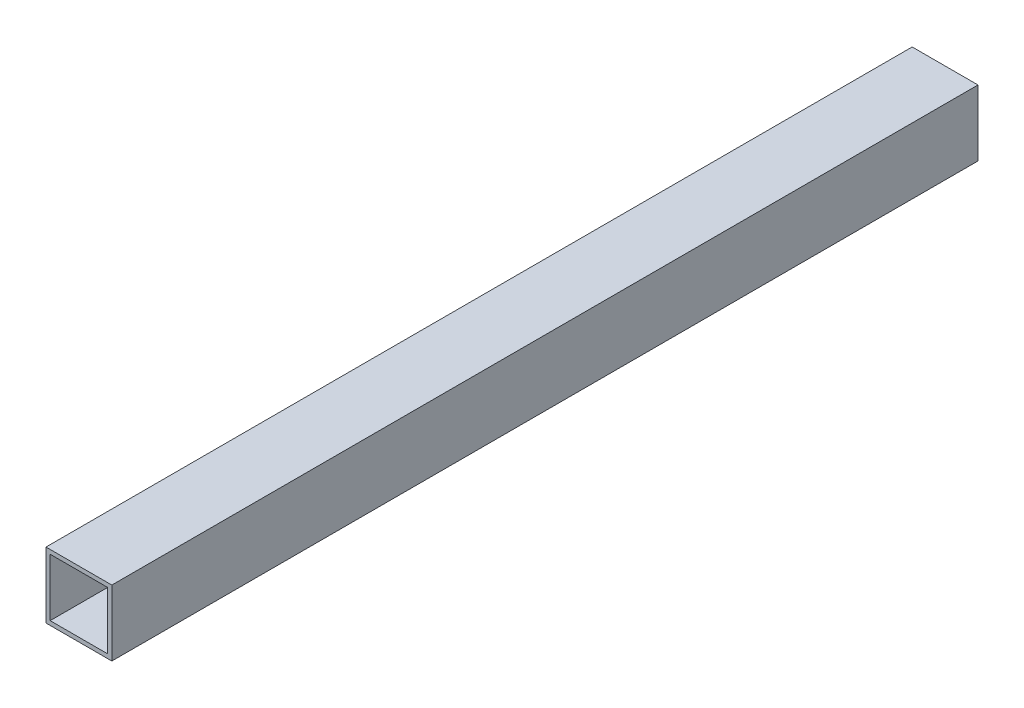
ISO-10303-21;
HEADER;
FILE_DESCRIPTION(('STEP AP214'),'2;1');
FILE_NAME('part.step','',(''),(''),'','','');
FILE_SCHEMA(('AUTOMOTIVE_DESIGN { 1 0 10303 214 1 1 1 1 }'));
ENDSEC;
DATA;
#1=APPLICATION_CONTEXT('core data for automotive mechanical design processes');
#2=APPLICATION_PROTOCOL_DEFINITION('international standard','automotive_design',2000,#1);
#3=PRODUCT_CONTEXT('',#1,'mechanical');
#4=PRODUCT('Part','Part','',(#3));
#5=PRODUCT_RELATED_PRODUCT_CATEGORY('part','',(#4));
#6=PRODUCT_DEFINITION_FORMATION('','',#4);
#7=PRODUCT_DEFINITION_CONTEXT('part definition',#1,'design');
#8=PRODUCT_DEFINITION('design','',#6,#7);
#9=PRODUCT_DEFINITION_SHAPE('','',#8);
#10=(LENGTH_UNIT() NAMED_UNIT(*) SI_UNIT(.MILLI.,.METRE.));
#11=(NAMED_UNIT(*) PLANE_ANGLE_UNIT() SI_UNIT($,.RADIAN.));
#12=(NAMED_UNIT(*) SI_UNIT($,.STERADIAN.) SOLID_ANGLE_UNIT());
#13=UNCERTAINTY_MEASURE_WITH_UNIT(LENGTH_MEASURE(1.E-05),#10,'distance_accuracy_value','');
#14=(GEOMETRIC_REPRESENTATION_CONTEXT(3) GLOBAL_UNCERTAINTY_ASSIGNED_CONTEXT((#13)) GLOBAL_UNIT_ASSIGNED_CONTEXT((#10,
#11,#12)) REPRESENTATION_CONTEXT('',''));
#15=CARTESIAN_POINT('',(0.,0.,0.));
#16=DIRECTION('',(0.,0.,1.));
#17=DIRECTION('',(1.,0.,0.));
#18=AXIS2_PLACEMENT_3D('',#15,#16,#17);
#19=CARTESIAN_POINT('',(0.,0.,250.));
#20=DIRECTION('',(0.,0.,1.));
#21=DIRECTION('',(1.,0.,0.));
#22=AXIS2_PLACEMENT_3D('',#19,#20,#21);
#23=PLANE('',#22);
#24=DIRECTION('',(0.,1.,0.));
#25=VECTOR('',#24,1.);
#26=CARTESIAN_POINT('',(9.50000000000002,9.50000000000001,250.));
#27=LINE('',#26,#25);
#28=CARTESIAN_POINT('',(9.50000000000002,-9.49999999999999,250.));
#29=VERTEX_POINT('',#28);
#30=CARTESIAN_POINT('',(9.50000000000002,9.50000000000001,250.));
#31=VERTEX_POINT('',#30);
#32=EDGE_CURVE('E134',#29,#31,#27,.T.);
#33=ORIENTED_EDGE('',*,*,#32,.T.);
#34=DIRECTION('',(-1.,0.,0.));
#35=VECTOR('',#34,1.);
#36=CARTESIAN_POINT('',(-9.49999999999998,9.50000000000001,250.));
#37=LINE('',#36,#35);
#38=CARTESIAN_POINT('',(-9.49999999999998,9.50000000000001,250.));
#39=VERTEX_POINT('',#38);
#40=EDGE_CURVE('E137',#31,#39,#37,.T.);
#41=ORIENTED_EDGE('',*,*,#40,.T.);
#42=DIRECTION('',(0.,-1.,0.));
#43=VECTOR('',#42,1.);
#44=CARTESIAN_POINT('',(-9.49999999999998,9.50000000000001,250.));
#45=LINE('',#44,#43);
#46=CARTESIAN_POINT('',(-9.49999999999998,-9.49999999999999,250.));
#47=VERTEX_POINT('',#46);
#48=EDGE_CURVE('E140',#39,#47,#45,.T.);
#49=ORIENTED_EDGE('',*,*,#48,.T.);
#50=DIRECTION('',(1.,0.,0.));
#51=VECTOR('',#50,1.);
#52=CARTESIAN_POINT('',(-9.49999999999998,-9.49999999999999,250.));
#53=LINE('',#52,#51);
#54=EDGE_CURVE('E142',#47,#29,#53,.T.);
#55=ORIENTED_EDGE('',*,*,#54,.T.);
#56=EDGE_LOOP('',(#33,#41,#49,#55));
#57=FACE_BOUND('',#56,.T.);
#58=DIRECTION('',(0.,-1.,0.));
#59=VECTOR('',#58,1.);
#60=CARTESIAN_POINT('',(-8.29999999999998,8.30000000000001,250.));
#61=LINE('',#60,#59);
#62=CARTESIAN_POINT('',(-8.29999999999998,8.30000000000001,250.));
#63=VERTEX_POINT('',#62);
#64=CARTESIAN_POINT('',(-8.29999999999998,-8.29999999999999,250.));
#65=VERTEX_POINT('',#64);
#66=EDGE_CURVE('E106',#63,#65,#61,.T.);
#67=ORIENTED_EDGE('',*,*,#66,.F.);
#68=DIRECTION('',(-1.,0.,0.));
#69=VECTOR('',#68,1.);
#70=CARTESIAN_POINT('',(-8.29999999999998,8.30000000000001,250.));
#71=LINE('',#70,#69);
#72=CARTESIAN_POINT('',(8.30000000000002,8.30000000000001,250.));
#73=VERTEX_POINT('',#72);
#74=EDGE_CURVE('E98',#73,#63,#71,.T.);
#75=ORIENTED_EDGE('',*,*,#74,.F.);
#76=DIRECTION('',(0.,1.,0.));
#77=VECTOR('',#76,1.);
#78=CARTESIAN_POINT('',(8.30000000000002,8.30000000000001,250.));
#79=LINE('',#78,#77);
#80=CARTESIAN_POINT('',(8.30000000000002,-8.29999999999999,250.));
#81=VERTEX_POINT('',#80);
#82=EDGE_CURVE('E120',#81,#73,#79,.T.);
#83=ORIENTED_EDGE('',*,*,#82,.F.);
#84=DIRECTION('',(1.,0.,0.));
#85=VECTOR('',#84,1.);
#86=CARTESIAN_POINT('',(-8.29999999999998,-8.29999999999999,250.));
#87=LINE('',#86,#85);
#88=EDGE_CURVE('E118',#65,#81,#87,.T.);
#89=ORIENTED_EDGE('',*,*,#88,.F.);
#90=EDGE_LOOP('',(#67,#75,#83,#89));
#91=FACE_BOUND('',#90,.T.);
#92=ADVANCED_FACE('F33',(#57,#91),#23,.T.);
#93=CARTESIAN_POINT('',(0.,0.,0.));
#94=DIRECTION('',(0.,0.,1.));
#95=DIRECTION('',(1.,0.,0.));
#96=AXIS2_PLACEMENT_3D('',#93,#94,#95);
#97=PLANE('',#96);
#98=DIRECTION('',(0.,1.,0.));
#99=VECTOR('',#98,1.);
#100=CARTESIAN_POINT('',(9.50000000000002,9.50000000000001,0.));
#101=LINE('',#100,#99);
#102=CARTESIAN_POINT('',(9.50000000000002,-9.49999999999999,0.));
#103=VERTEX_POINT('',#102);
#104=CARTESIAN_POINT('',(9.50000000000002,9.50000000000001,0.));
#105=VERTEX_POINT('',#104);
#106=EDGE_CURVE('E114',#103,#105,#101,.T.);
#107=ORIENTED_EDGE('',*,*,#106,.F.);
#108=DIRECTION('',(1.,0.,0.));
#109=VECTOR('',#108,1.);
#110=CARTESIAN_POINT('',(-9.49999999999998,-9.49999999999999,0.));
#111=LINE('',#110,#109);
#112=CARTESIAN_POINT('',(-9.49999999999998,-9.49999999999999,0.));
#113=VERTEX_POINT('',#112);
#114=EDGE_CURVE('E138',#113,#103,#111,.T.);
#115=ORIENTED_EDGE('',*,*,#114,.F.);
#116=DIRECTION('',(0.,-1.,0.));
#117=VECTOR('',#116,1.);
#118=CARTESIAN_POINT('',(-9.49999999999998,9.50000000000001,0.));
#119=LINE('',#118,#117);
#120=CARTESIAN_POINT('',(-9.49999999999998,9.50000000000001,0.));
#121=VERTEX_POINT('',#120);
#122=EDGE_CURVE('E149',#121,#113,#119,.T.);
#123=ORIENTED_EDGE('',*,*,#122,.F.);
#124=DIRECTION('',(-1.,0.,0.));
#125=VECTOR('',#124,1.);
#126=CARTESIAN_POINT('',(-9.49999999999998,9.50000000000001,0.));
#127=LINE('',#126,#125);
#128=EDGE_CURVE('E147',#105,#121,#127,.T.);
#129=ORIENTED_EDGE('',*,*,#128,.F.);
#130=EDGE_LOOP('',(#107,#115,#123,#129));
#131=FACE_BOUND('',#130,.T.);
#132=DIRECTION('',(-1.,0.,0.));
#133=VECTOR('',#132,1.);
#134=CARTESIAN_POINT('',(-8.29999999999998,8.30000000000001,0.));
#135=LINE('',#134,#133);
#136=CARTESIAN_POINT('',(8.30000000000002,8.30000000000001,0.));
#137=VERTEX_POINT('',#136);
#138=CARTESIAN_POINT('',(-8.29999999999998,8.30000000000001,0.));
#139=VERTEX_POINT('',#138);
#140=EDGE_CURVE('E56',#137,#139,#135,.T.);
#141=ORIENTED_EDGE('',*,*,#140,.T.);
#142=DIRECTION('',(0.,-1.,0.));
#143=VECTOR('',#142,1.);
#144=CARTESIAN_POINT('',(-8.29999999999998,8.30000000000001,0.));
#145=LINE('',#144,#143);
#146=CARTESIAN_POINT('',(-8.29999999999998,-8.29999999999999,0.));
#147=VERTEX_POINT('',#146);
#148=EDGE_CURVE('E113',#139,#147,#145,.T.);
#149=ORIENTED_EDGE('',*,*,#148,.T.);
#150=DIRECTION('',(1.,0.,0.));
#151=VECTOR('',#150,1.);
#152=CARTESIAN_POINT('',(-8.29999999999998,-8.29999999999999,0.));
#153=LINE('',#152,#151);
#154=CARTESIAN_POINT('',(8.30000000000002,-8.29999999999999,0.));
#155=VERTEX_POINT('',#154);
#156=EDGE_CURVE('E126',#147,#155,#153,.T.);
#157=ORIENTED_EDGE('',*,*,#156,.T.);
#158=DIRECTION('',(0.,1.,0.));
#159=VECTOR('',#158,1.);
#160=CARTESIAN_POINT('',(8.30000000000002,8.30000000000001,0.));
#161=LINE('',#160,#159);
#162=EDGE_CURVE('E107',#155,#137,#161,.T.);
#163=ORIENTED_EDGE('',*,*,#162,.T.);
#164=EDGE_LOOP('',(#141,#149,#157,#163));
#165=FACE_BOUND('',#164,.T.);
#166=ADVANCED_FACE('F167',(#131,#165),#97,.F.);
#167=CARTESIAN_POINT('',(9.50000000000002,9.50000000000001,250.));
#168=DIRECTION('',(-1.,0.,0.));
#169=DIRECTION('',(0.,0.,1.));
#170=AXIS2_PLACEMENT_3D('',#167,#168,#169);
#171=PLANE('',#170);
#172=ORIENTED_EDGE('',*,*,#106,.T.);
#173=DIRECTION('',(0.,0.,-1.));
#174=VECTOR('',#173,1.);
#175=CARTESIAN_POINT('',(9.50000000000002,9.50000000000001,250.));
#176=LINE('',#175,#174);
#177=EDGE_CURVE('E11',#31,#105,#176,.T.);
#178=ORIENTED_EDGE('',*,*,#177,.F.);
#179=ORIENTED_EDGE('',*,*,#32,.F.);
#180=DIRECTION('',(0.,0.,-1.));
#181=VECTOR('',#180,1.);
#182=CARTESIAN_POINT('',(9.50000000000002,-9.49999999999999,250.));
#183=LINE('',#182,#181);
#184=EDGE_CURVE('E144',#29,#103,#183,.T.);
#185=ORIENTED_EDGE('',*,*,#184,.T.);
#186=EDGE_LOOP('',(#172,#178,#179,#185));
#187=FACE_BOUND('',#186,.T.);
#188=ADVANCED_FACE('F35',(#187),#171,.F.);
#189=CARTESIAN_POINT('',(-9.49999999999998,9.50000000000001,250.));
#190=DIRECTION('',(0.,-1.,0.));
#191=DIRECTION('',(0.,0.,-1.));
#192=AXIS2_PLACEMENT_3D('',#189,#190,#191);
#193=PLANE('',#192);
#194=ORIENTED_EDGE('',*,*,#128,.T.);
#195=DIRECTION('',(0.,0.,-1.));
#196=VECTOR('',#195,1.);
#197=CARTESIAN_POINT('',(-9.49999999999998,9.50000000000001,250.));
#198=LINE('',#197,#196);
#199=EDGE_CURVE('E41',#39,#121,#198,.T.);
#200=ORIENTED_EDGE('',*,*,#199,.F.);
#201=ORIENTED_EDGE('',*,*,#40,.F.);
#202=ORIENTED_EDGE('',*,*,#177,.T.);
#203=EDGE_LOOP('',(#194,#200,#201,#202));
#204=FACE_BOUND('',#203,.T.);
#205=ADVANCED_FACE('F177',(#204),#193,.F.);
#206=CARTESIAN_POINT('',(-9.49999999999998,9.50000000000001,250.));
#207=DIRECTION('',(1.,0.,0.));
#208=DIRECTION('',(0.,0.,-1.));
#209=AXIS2_PLACEMENT_3D('',#206,#207,#208);
#210=PLANE('',#209);
#211=ORIENTED_EDGE('',*,*,#122,.T.);
#212=DIRECTION('',(0.,0.,-1.));
#213=VECTOR('',#212,1.);
#214=CARTESIAN_POINT('',(-9.49999999999998,-9.49999999999999,250.));
#215=LINE('',#214,#213);
#216=EDGE_CURVE('E154',#47,#113,#215,.T.);
#217=ORIENTED_EDGE('',*,*,#216,.F.);
#218=ORIENTED_EDGE('',*,*,#48,.F.);
#219=ORIENTED_EDGE('',*,*,#199,.T.);
#220=EDGE_LOOP('',(#211,#217,#218,#219));
#221=FACE_BOUND('',#220,.T.);
#222=ADVANCED_FACE('F161',(#221),#210,.F.);
#223=CARTESIAN_POINT('',(-9.49999999999998,-9.49999999999999,250.));
#224=DIRECTION('',(0.,1.,0.));
#225=DIRECTION('',(0.,0.,1.));
#226=AXIS2_PLACEMENT_3D('',#223,#224,#225);
#227=PLANE('',#226);
#228=ORIENTED_EDGE('',*,*,#114,.T.);
#229=ORIENTED_EDGE('',*,*,#184,.F.);
#230=ORIENTED_EDGE('',*,*,#54,.F.);
#231=ORIENTED_EDGE('',*,*,#216,.T.);
#232=EDGE_LOOP('',(#228,#229,#230,#231));
#233=FACE_BOUND('',#232,.T.);
#234=ADVANCED_FACE('F171',(#233),#227,.F.);
#235=CARTESIAN_POINT('',(-8.29999999999998,8.30000000000001,250.));
#236=DIRECTION('',(0.,-1.,0.));
#237=DIRECTION('',(0.,0.,-1.));
#238=AXIS2_PLACEMENT_3D('',#235,#236,#237);
#239=PLANE('',#238);
#240=ORIENTED_EDGE('',*,*,#140,.F.);
#241=DIRECTION('',(0.,0.,-1.));
#242=VECTOR('',#241,1.);
#243=CARTESIAN_POINT('',(8.30000000000002,8.30000000000001,250.));
#244=LINE('',#243,#242);
#245=EDGE_CURVE('E102',#73,#137,#244,.T.);
#246=ORIENTED_EDGE('',*,*,#245,.F.);
#247=ORIENTED_EDGE('',*,*,#74,.T.);
#248=DIRECTION('',(0.,0.,-1.));
#249=VECTOR('',#248,1.);
#250=CARTESIAN_POINT('',(-8.29999999999998,8.30000000000001,250.));
#251=LINE('',#250,#249);
#252=EDGE_CURVE('E101',#63,#139,#251,.T.);
#253=ORIENTED_EDGE('',*,*,#252,.T.);
#254=EDGE_LOOP('',(#240,#246,#247,#253));
#255=FACE_BOUND('',#254,.T.);
#256=ADVANCED_FACE('F100',(#255),#239,.T.);
#257=CARTESIAN_POINT('',(-8.29999999999998,8.30000000000001,250.));
#258=DIRECTION('',(1.,0.,0.));
#259=DIRECTION('',(0.,0.,-1.));
#260=AXIS2_PLACEMENT_3D('',#257,#258,#259);
#261=PLANE('',#260);
#262=ORIENTED_EDGE('',*,*,#148,.F.);
#263=ORIENTED_EDGE('',*,*,#252,.F.);
#264=ORIENTED_EDGE('',*,*,#66,.T.);
#265=DIRECTION('',(0.,0.,-1.));
#266=VECTOR('',#265,1.);
#267=CARTESIAN_POINT('',(-8.29999999999998,-8.29999999999999,250.));
#268=LINE('',#267,#266);
#269=EDGE_CURVE('E115',#65,#147,#268,.T.);
#270=ORIENTED_EDGE('',*,*,#269,.T.);
#271=EDGE_LOOP('',(#262,#263,#264,#270));
#272=FACE_BOUND('',#271,.T.);
#273=ADVANCED_FACE('F110',(#272),#261,.T.);
#274=CARTESIAN_POINT('',(-8.29999999999998,-8.29999999999999,250.));
#275=DIRECTION('',(0.,1.,0.));
#276=DIRECTION('',(0.,0.,1.));
#277=AXIS2_PLACEMENT_3D('',#274,#275,#276);
#278=PLANE('',#277);
#279=ORIENTED_EDGE('',*,*,#156,.F.);
#280=ORIENTED_EDGE('',*,*,#269,.F.);
#281=ORIENTED_EDGE('',*,*,#88,.T.);
#282=DIRECTION('',(0.,0.,-1.));
#283=VECTOR('',#282,1.);
#284=CARTESIAN_POINT('',(8.30000000000002,-8.29999999999999,250.));
#285=LINE('',#284,#283);
#286=EDGE_CURVE('E48',#81,#155,#285,.T.);
#287=ORIENTED_EDGE('',*,*,#286,.T.);
#288=EDGE_LOOP('',(#279,#280,#281,#287));
#289=FACE_BOUND('',#288,.T.);
#290=ADVANCED_FACE('F200',(#289),#278,.T.);
#291=CARTESIAN_POINT('',(8.30000000000002,8.30000000000001,250.));
#292=DIRECTION('',(-1.,0.,0.));
#293=DIRECTION('',(0.,0.,1.));
#294=AXIS2_PLACEMENT_3D('',#291,#292,#293);
#295=PLANE('',#294);
#296=ORIENTED_EDGE('',*,*,#162,.F.);
#297=ORIENTED_EDGE('',*,*,#286,.F.);
#298=ORIENTED_EDGE('',*,*,#82,.T.);
#299=ORIENTED_EDGE('',*,*,#245,.T.);
#300=EDGE_LOOP('',(#296,#297,#298,#299));
#301=FACE_BOUND('',#300,.T.);
#302=ADVANCED_FACE('F204',(#301),#295,.T.);
#303=CLOSED_SHELL('',(#92,#166,#188,#205,#222,#234,#256,#273,#290,#302));
#304=MANIFOLD_SOLID_BREP('B2',#303);
#305=ADVANCED_BREP_SHAPE_REPRESENTATION('',(#18,#304),#14);
#306=SHAPE_DEFINITION_REPRESENTATION(#9,#305);
ENDSEC;
END-ISO-10303-21;
